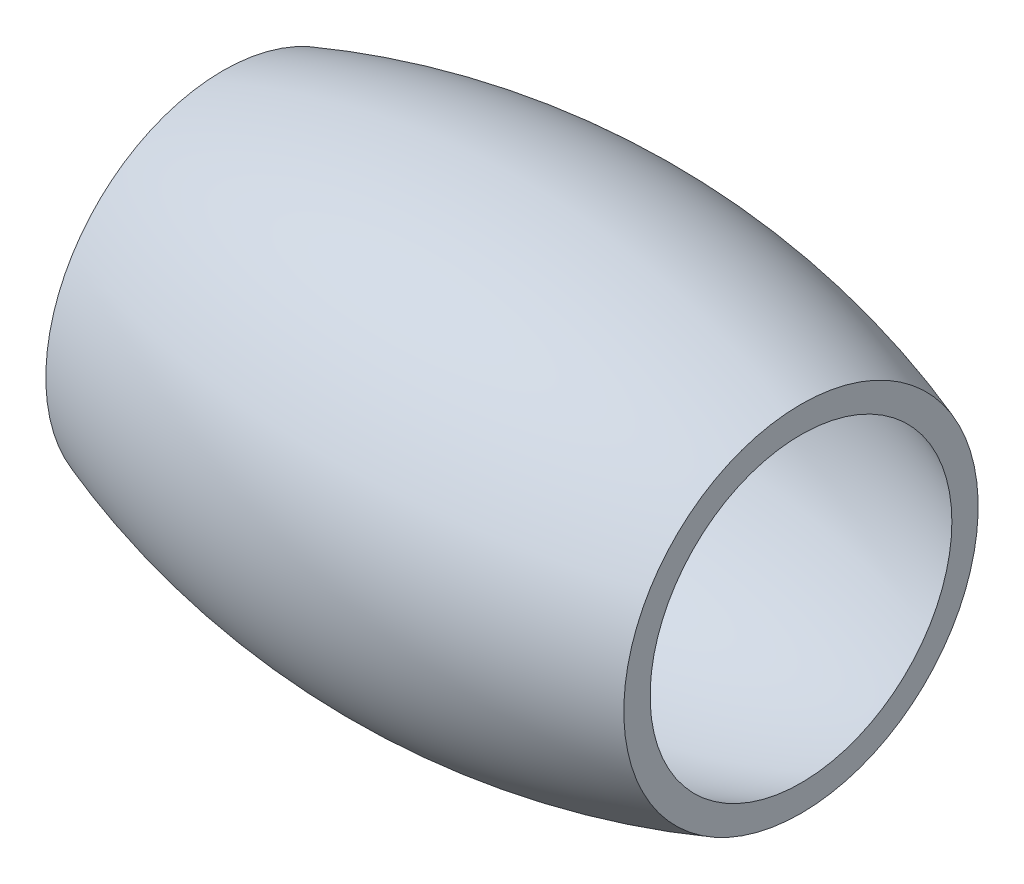
ISO-10303-21;
HEADER;
FILE_DESCRIPTION(('STEP AP214'),'2;1');
FILE_NAME('part.step','',(''),(''),'','','');
FILE_SCHEMA(('AUTOMOTIVE_DESIGN { 1 0 10303 214 1 1 1 1 }'));
ENDSEC;
DATA;
#1=APPLICATION_CONTEXT('core data for automotive mechanical design processes');
#2=APPLICATION_PROTOCOL_DEFINITION('international standard','automotive_design',2000,#1);
#3=PRODUCT_CONTEXT('',#1,'mechanical');
#4=PRODUCT('Part','Part','',(#3));
#5=PRODUCT_RELATED_PRODUCT_CATEGORY('part','',(#4));
#6=PRODUCT_DEFINITION_FORMATION('','',#4);
#7=PRODUCT_DEFINITION_CONTEXT('part definition',#1,'design');
#8=PRODUCT_DEFINITION('design','',#6,#7);
#9=PRODUCT_DEFINITION_SHAPE('','',#8);
#10=(LENGTH_UNIT() NAMED_UNIT(*) SI_UNIT(.MILLI.,.METRE.));
#11=(NAMED_UNIT(*) PLANE_ANGLE_UNIT() SI_UNIT($,.RADIAN.));
#12=(NAMED_UNIT(*) SI_UNIT($,.STERADIAN.) SOLID_ANGLE_UNIT());
#13=UNCERTAINTY_MEASURE_WITH_UNIT(LENGTH_MEASURE(1.E-05),#10,'distance_accuracy_value','');
#14=(GEOMETRIC_REPRESENTATION_CONTEXT(3) GLOBAL_UNCERTAINTY_ASSIGNED_CONTEXT((#13)) GLOBAL_UNIT_ASSIGNED_CONTEXT((#10,
#11,#12)) REPRESENTATION_CONTEXT('',''));
#15=CARTESIAN_POINT('',(0.,0.,0.));
#16=DIRECTION('',(0.,0.,1.));
#17=DIRECTION('',(1.,0.,0.));
#18=AXIS2_PLACEMENT_3D('',#15,#16,#17);
#19=CARTESIAN_POINT('',(0.,25.8296398570499,0.));
#20=DIRECTION('',(1.,0.,0.));
#21=DIRECTION('',(0.,0.,-1.));
#22=AXIS2_PLACEMENT_3D('',#19,#20,#21);
#23=DEGENERATE_TOROIDAL_SURFACE('',#22,25.8296398570499,34.0000000001755,.F.);
#24=CARTESIAN_POINT('',(-11.6832400732423,25.8296398570499,0.));
#25=DIRECTION('',(1.,0.,0.));
#26=DIRECTION('',(0.,0.,-1.));
#27=AXIS2_PLACEMENT_3D('',#24,#25,#26);
#28=CIRCLE('',#27,6.1000000000315);
#29=CARTESIAN_POINT('',(-11.6832400732423,25.8296398570499,-6.1000000000315));
#30=VERTEX_POINT('',#29);
#31=EDGE_CURVE('E19',#30,#30,#28,.T.);
#32=ORIENTED_EDGE('',*,*,#31,.F.);
#33=EDGE_LOOP('',(#32));
#34=FACE_BOUND('',#33,.T.);
#35=CARTESIAN_POINT('',(11.6832400732423,25.8296398570499,0.));
#36=DIRECTION('',(1.,0.,0.));
#37=DIRECTION('',(0.,0.,-1.));
#38=AXIS2_PLACEMENT_3D('',#35,#36,#37);
#39=CIRCLE('',#38,6.10000000003149);
#40=CARTESIAN_POINT('',(11.6832400732423,25.8296398570499,-6.10000000003149));
#41=VERTEX_POINT('',#40);
#42=EDGE_CURVE('E28',#41,#41,#39,.F.);
#43=ORIENTED_EDGE('',*,*,#42,.F.);
#44=EDGE_LOOP('',(#43));
#45=FACE_BOUND('',#44,.T.);
#46=ADVANCED_FACE('F15',(#34,#45),#23,.T.);
#47=CARTESIAN_POINT('',(-11.6832400732423,32.9924521882049,0.));
#48=DIRECTION('',(-1.,0.,0.));
#49=DIRECTION('',(0.,-1.,0.));
#50=AXIS2_PLACEMENT_3D('',#47,#48,#49);
#51=PLANE('',#50);
#52=ORIENTED_EDGE('',*,*,#31,.T.);
#53=EDGE_LOOP('',(#52));
#54=FACE_BOUND('',#53,.T.);
#55=CARTESIAN_POINT('',(-11.6832400732423,25.8296398570499,0.));
#56=DIRECTION('',(1.,0.,0.));
#57=DIRECTION('',(0.,1.,0.));
#58=AXIS2_PLACEMENT_3D('',#55,#56,#57);
#59=CIRCLE('',#58,7.162812331155);
#60=CARTESIAN_POINT('',(-11.6832400732423,32.9924521882049,0.));
#61=VERTEX_POINT('',#60);
#62=EDGE_CURVE('E23',#61,#61,#59,.F.);
#63=ORIENTED_EDGE('',*,*,#62,.T.);
#64=EDGE_LOOP('',(#63));
#65=FACE_BOUND('',#64,.T.);
#66=ADVANCED_FACE('F36',(#54,#65),#51,.T.);
#67=CARTESIAN_POINT('',(11.6832400732423,31.9296398570814,0.));
#68=DIRECTION('',(1.,0.,0.));
#69=DIRECTION('',(0.,1.,0.));
#70=AXIS2_PLACEMENT_3D('',#67,#68,#69);
#71=PLANE('',#70);
#72=ORIENTED_EDGE('',*,*,#42,.T.);
#73=EDGE_LOOP('',(#72));
#74=FACE_BOUND('',#73,.T.);
#75=CARTESIAN_POINT('',(11.6832400732423,25.8296398570499,0.));
#76=DIRECTION('',(1.,0.,0.));
#77=DIRECTION('',(0.,1.,0.));
#78=AXIS2_PLACEMENT_3D('',#75,#76,#77);
#79=CIRCLE('',#78,7.16281233115501);
#80=CARTESIAN_POINT('',(11.6832400732423,32.9924521882049,0.));
#81=VERTEX_POINT('',#80);
#82=EDGE_CURVE('E10',#81,#81,#79,.T.);
#83=ORIENTED_EDGE('',*,*,#82,.T.);
#84=EDGE_LOOP('',(#83));
#85=FACE_BOUND('',#84,.T.);
#86=ADVANCED_FACE('F45',(#74,#85),#71,.T.);
#87=CARTESIAN_POINT('',(0.,25.8296398570499,0.));
#88=DIRECTION('',(1.,0.,0.));
#89=DIRECTION('',(0.,1.,0.));
#90=AXIS2_PLACEMENT_3D('',#87,#88,#89);
#91=DEGENERATE_TOROIDAL_SURFACE('',#90,25.8296398570504,35.0000000000005,.F.);
#92=ORIENTED_EDGE('',*,*,#62,.F.);
#93=EDGE_LOOP('',(#92));
#94=FACE_BOUND('',#93,.T.);
#95=ORIENTED_EDGE('',*,*,#82,.F.);
#96=EDGE_LOOP('',(#95));
#97=FACE_BOUND('',#96,.T.);
#98=ADVANCED_FACE('F17',(#94,#97),#91,.F.);
#99=CLOSED_SHELL('',(#46,#66,#86,#98));
#100=MANIFOLD_SOLID_BREP('B1',#99);
#101=ADVANCED_BREP_SHAPE_REPRESENTATION('',(#18,#100),#14);
#102=SHAPE_DEFINITION_REPRESENTATION(#9,#101);
ENDSEC;
END-ISO-10303-21;
